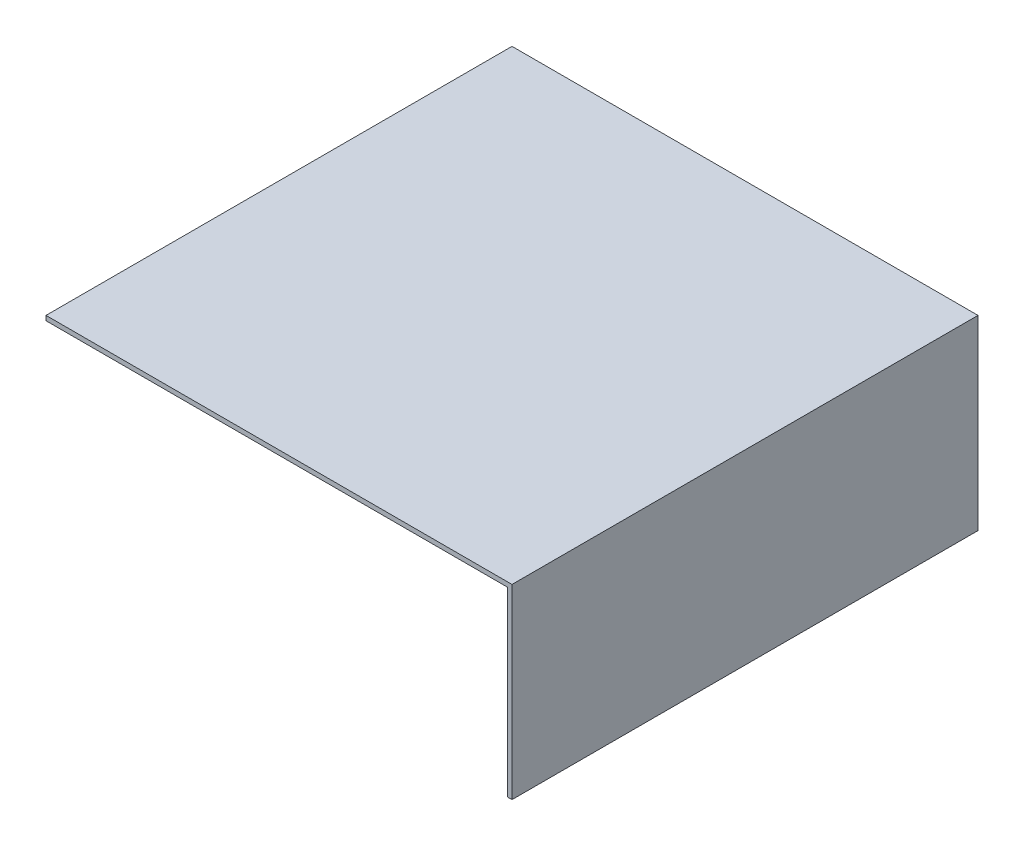
ISO-10303-21;
HEADER;
FILE_DESCRIPTION(('STEP AP214'),'2;1');
FILE_NAME('part.step','',(''),(''),'','','');
FILE_SCHEMA(('AUTOMOTIVE_DESIGN { 1 0 10303 214 1 1 1 1 }'));
ENDSEC;
DATA;
#1=APPLICATION_CONTEXT('core data for automotive mechanical design processes');
#2=APPLICATION_PROTOCOL_DEFINITION('international standard','automotive_design',2000,#1);
#3=PRODUCT_CONTEXT('',#1,'mechanical');
#4=PRODUCT('Part','Part','',(#3));
#5=PRODUCT_RELATED_PRODUCT_CATEGORY('part','',(#4));
#6=PRODUCT_DEFINITION_FORMATION('','',#4);
#7=PRODUCT_DEFINITION_CONTEXT('part definition',#1,'design');
#8=PRODUCT_DEFINITION('design','',#6,#7);
#9=PRODUCT_DEFINITION_SHAPE('','',#8);
#10=(LENGTH_UNIT() NAMED_UNIT(*) SI_UNIT(.MILLI.,.METRE.));
#11=(NAMED_UNIT(*) PLANE_ANGLE_UNIT() SI_UNIT($,.RADIAN.));
#12=(NAMED_UNIT(*) SI_UNIT($,.STERADIAN.) SOLID_ANGLE_UNIT());
#13=UNCERTAINTY_MEASURE_WITH_UNIT(LENGTH_MEASURE(1.E-05),#10,'distance_accuracy_value','');
#14=(GEOMETRIC_REPRESENTATION_CONTEXT(3) GLOBAL_UNCERTAINTY_ASSIGNED_CONTEXT((#13)) GLOBAL_UNIT_ASSIGNED_CONTEXT((#10,
#11,#12)) REPRESENTATION_CONTEXT('',''));
#15=CARTESIAN_POINT('',(0.,0.,0.));
#16=DIRECTION('',(0.,0.,1.));
#17=DIRECTION('',(1.,0.,0.));
#18=AXIS2_PLACEMENT_3D('',#15,#16,#17);
#19=CARTESIAN_POINT('',(-500.,-5.,250.));
#20=DIRECTION('',(1.,0.,0.));
#21=DIRECTION('',(0.,0.,-1.));
#22=AXIS2_PLACEMENT_3D('',#19,#20,#21);
#23=PLANE('',#22);
#24=DIRECTION('',(0.,-1.,0.));
#25=VECTOR('',#24,1.);
#26=CARTESIAN_POINT('',(-500.,-5.,-250.));
#27=LINE('',#26,#25);
#28=CARTESIAN_POINT('',(-500.,0.,-250.));
#29=VERTEX_POINT('',#28);
#30=CARTESIAN_POINT('',(-500.,-5.,-250.));
#31=VERTEX_POINT('',#30);
#32=EDGE_CURVE('E117',#29,#31,#27,.T.);
#33=ORIENTED_EDGE('',*,*,#32,.T.);
#34=DIRECTION('',(0.,0.,-1.));
#35=VECTOR('',#34,1.);
#36=CARTESIAN_POINT('',(-500.,-5.,250.));
#37=LINE('',#36,#35);
#38=CARTESIAN_POINT('',(-500.,-5.,250.));
#39=VERTEX_POINT('',#38);
#40=EDGE_CURVE('E11',#39,#31,#37,.T.);
#41=ORIENTED_EDGE('',*,*,#40,.F.);
#42=DIRECTION('',(0.,-1.,0.));
#43=VECTOR('',#42,1.);
#44=CARTESIAN_POINT('',(-500.,-5.,250.));
#45=LINE('',#44,#43);
#46=CARTESIAN_POINT('',(-500.,0.,250.));
#47=VERTEX_POINT('',#46);
#48=EDGE_CURVE('E127',#47,#39,#45,.T.);
#49=ORIENTED_EDGE('',*,*,#48,.F.);
#50=DIRECTION('',(0.,0.,-1.));
#51=VECTOR('',#50,1.);
#52=CARTESIAN_POINT('',(-500.,0.,250.));
#53=LINE('',#52,#51);
#54=EDGE_CURVE('E113',#47,#29,#53,.T.);
#55=ORIENTED_EDGE('',*,*,#54,.T.);
#56=EDGE_LOOP('',(#33,#41,#49,#55));
#57=FACE_BOUND('',#56,.T.);
#58=ADVANCED_FACE('F33',(#57),#23,.F.);
#59=CARTESIAN_POINT('',(-4.99999999999998,-5.,250.));
#60=DIRECTION('',(0.,1.,0.));
#61=DIRECTION('',(-1.,0.,0.));
#62=AXIS2_PLACEMENT_3D('',#59,#60,#61);
#63=PLANE('',#62);
#64=DIRECTION('',(1.,0.,0.));
#65=VECTOR('',#64,1.);
#66=CARTESIAN_POINT('',(-4.99999999999998,-5.,-250.));
#67=LINE('',#66,#65);
#68=CARTESIAN_POINT('',(-4.99999999999998,-5.,-250.));
#69=VERTEX_POINT('',#68);
#70=EDGE_CURVE('E120',#31,#69,#67,.T.);
#71=ORIENTED_EDGE('',*,*,#70,.T.);
#72=DIRECTION('',(0.,0.,-1.));
#73=VECTOR('',#72,1.);
#74=CARTESIAN_POINT('',(-4.99999999999998,-5.,250.));
#75=LINE('',#74,#73);
#76=CARTESIAN_POINT('',(-4.99999999999998,-5.,250.));
#77=VERTEX_POINT('',#76);
#78=EDGE_CURVE('E41',#77,#69,#75,.T.);
#79=ORIENTED_EDGE('',*,*,#78,.F.);
#80=DIRECTION('',(1.,0.,0.));
#81=VECTOR('',#80,1.);
#82=CARTESIAN_POINT('',(-4.99999999999998,-5.,250.));
#83=LINE('',#82,#81);
#84=EDGE_CURVE('E86',#39,#77,#83,.T.);
#85=ORIENTED_EDGE('',*,*,#84,.F.);
#86=ORIENTED_EDGE('',*,*,#40,.T.);
#87=EDGE_LOOP('',(#71,#79,#85,#86));
#88=FACE_BOUND('',#87,.T.);
#89=ADVANCED_FACE('F151',(#88),#63,.F.);
#90=CARTESIAN_POINT('',(-4.99999999999998,-200.,250.));
#91=DIRECTION('',(1.,0.,0.));
#92=DIRECTION('',(0.,0.,-1.));
#93=AXIS2_PLACEMENT_3D('',#90,#91,#92);
#94=PLANE('',#93);
#95=DIRECTION('',(0.,-1.,0.));
#96=VECTOR('',#95,1.);
#97=CARTESIAN_POINT('',(-4.99999999999998,-200.,-250.));
#98=LINE('',#97,#96);
#99=CARTESIAN_POINT('',(-4.99999999999998,-200.,-250.));
#100=VERTEX_POINT('',#99);
#101=EDGE_CURVE('E122',#69,#100,#98,.T.);
#102=ORIENTED_EDGE('',*,*,#101,.T.);
#103=DIRECTION('',(0.,0.,-1.));
#104=VECTOR('',#103,1.);
#105=CARTESIAN_POINT('',(-4.99999999999998,-200.,250.));
#106=LINE('',#105,#104);
#107=CARTESIAN_POINT('',(-4.99999999999998,-200.,250.));
#108=VERTEX_POINT('',#107);
#109=EDGE_CURVE('E108',#108,#100,#106,.T.);
#110=ORIENTED_EDGE('',*,*,#109,.F.);
#111=DIRECTION('',(0.,-1.,0.));
#112=VECTOR('',#111,1.);
#113=CARTESIAN_POINT('',(-4.99999999999998,-200.,250.));
#114=LINE('',#113,#112);
#115=EDGE_CURVE('E99',#77,#108,#114,.T.);
#116=ORIENTED_EDGE('',*,*,#115,.F.);
#117=ORIENTED_EDGE('',*,*,#78,.T.);
#118=EDGE_LOOP('',(#102,#110,#116,#117));
#119=FACE_BOUND('',#118,.T.);
#120=ADVANCED_FACE('F133',(#119),#94,.F.);
#121=CARTESIAN_POINT('',(0.,-200.,250.));
#122=DIRECTION('',(0.,1.,0.));
#123=DIRECTION('',(0.,0.,1.));
#124=AXIS2_PLACEMENT_3D('',#121,#122,#123);
#125=PLANE('',#124);
#126=DIRECTION('',(1.,0.,0.));
#127=VECTOR('',#126,1.);
#128=CARTESIAN_POINT('',(0.,-200.,-250.));
#129=LINE('',#128,#127);
#130=CARTESIAN_POINT('',(0.,-200.,-250.));
#131=VERTEX_POINT('',#130);
#132=EDGE_CURVE('E107',#100,#131,#129,.T.);
#133=ORIENTED_EDGE('',*,*,#132,.T.);
#134=DIRECTION('',(0.,0.,-1.));
#135=VECTOR('',#134,1.);
#136=CARTESIAN_POINT('',(0.,-200.,250.));
#137=LINE('',#136,#135);
#138=CARTESIAN_POINT('',(0.,-200.,250.));
#139=VERTEX_POINT('',#138);
#140=EDGE_CURVE('E104',#139,#131,#137,.T.);
#141=ORIENTED_EDGE('',*,*,#140,.F.);
#142=DIRECTION('',(1.,0.,0.));
#143=VECTOR('',#142,1.);
#144=CARTESIAN_POINT('',(0.,-200.,250.));
#145=LINE('',#144,#143);
#146=EDGE_CURVE('E93',#108,#139,#145,.T.);
#147=ORIENTED_EDGE('',*,*,#146,.F.);
#148=ORIENTED_EDGE('',*,*,#109,.T.);
#149=EDGE_LOOP('',(#133,#141,#147,#148));
#150=FACE_BOUND('',#149,.T.);
#151=ADVANCED_FACE('F105',(#150),#125,.F.);
#152=CARTESIAN_POINT('',(0.,0.,250.));
#153=DIRECTION('',(-1.,0.,0.));
#154=DIRECTION('',(0.,-1.,0.));
#155=AXIS2_PLACEMENT_3D('',#152,#153,#154);
#156=PLANE('',#155);
#157=DIRECTION('',(0.,1.,0.));
#158=VECTOR('',#157,1.);
#159=CARTESIAN_POINT('',(0.,0.,-250.));
#160=LINE('',#159,#158);
#161=CARTESIAN_POINT('',(0.,0.,-250.));
#162=VERTEX_POINT('',#161);
#163=EDGE_CURVE('E72',#131,#162,#160,.T.);
#164=ORIENTED_EDGE('',*,*,#163,.T.);
#165=DIRECTION('',(0.,0.,-1.));
#166=VECTOR('',#165,1.);
#167=CARTESIAN_POINT('',(0.,0.,250.));
#168=LINE('',#167,#166);
#169=CARTESIAN_POINT('',(0.,0.,250.));
#170=VERTEX_POINT('',#169);
#171=EDGE_CURVE('E109',#170,#162,#168,.T.);
#172=ORIENTED_EDGE('',*,*,#171,.F.);
#173=DIRECTION('',(0.,1.,0.));
#174=VECTOR('',#173,1.);
#175=CARTESIAN_POINT('',(0.,0.,250.));
#176=LINE('',#175,#174);
#177=EDGE_CURVE('E97',#139,#170,#176,.T.);
#178=ORIENTED_EDGE('',*,*,#177,.F.);
#179=ORIENTED_EDGE('',*,*,#140,.T.);
#180=EDGE_LOOP('',(#164,#172,#178,#179));
#181=FACE_BOUND('',#180,.T.);
#182=ADVANCED_FACE('F111',(#181),#156,.F.);
#183=CARTESIAN_POINT('',(-500.,0.,250.));
#184=DIRECTION('',(0.,-1.,0.));
#185=DIRECTION('',(0.,0.,-1.));
#186=AXIS2_PLACEMENT_3D('',#183,#184,#185);
#187=PLANE('',#186);
#188=DIRECTION('',(-1.,0.,0.));
#189=VECTOR('',#188,1.);
#190=CARTESIAN_POINT('',(-500.,0.,-250.));
#191=LINE('',#190,#189);
#192=EDGE_CURVE('E78',#162,#29,#191,.T.);
#193=ORIENTED_EDGE('',*,*,#192,.T.);
#194=ORIENTED_EDGE('',*,*,#54,.F.);
#195=DIRECTION('',(-1.,0.,0.));
#196=VECTOR('',#195,1.);
#197=CARTESIAN_POINT('',(-500.,0.,250.));
#198=LINE('',#197,#196);
#199=EDGE_CURVE('E49',#170,#47,#198,.T.);
#200=ORIENTED_EDGE('',*,*,#199,.F.);
#201=ORIENTED_EDGE('',*,*,#171,.T.);
#202=EDGE_LOOP('',(#193,#194,#200,#201));
#203=FACE_BOUND('',#202,.T.);
#204=ADVANCED_FACE('F140',(#203),#187,.F.);
#205=CARTESIAN_POINT('',(0.,0.,250.));
#206=DIRECTION('',(0.,0.,-1.));
#207=DIRECTION('',(-1.,0.,0.));
#208=AXIS2_PLACEMENT_3D('',#205,#206,#207);
#209=PLANE('',#208);
#210=ORIENTED_EDGE('',*,*,#48,.T.);
#211=ORIENTED_EDGE('',*,*,#84,.T.);
#212=ORIENTED_EDGE('',*,*,#115,.T.);
#213=ORIENTED_EDGE('',*,*,#146,.T.);
#214=ORIENTED_EDGE('',*,*,#177,.T.);
#215=ORIENTED_EDGE('',*,*,#199,.T.);
#216=EDGE_LOOP('',(#210,#211,#212,#213,#214,#215));
#217=FACE_BOUND('',#216,.T.);
#218=ADVANCED_FACE('F95',(#217),#209,.F.);
#219=CARTESIAN_POINT('',(0.,0.,-250.));
#220=DIRECTION('',(0.,0.,-1.));
#221=DIRECTION('',(-1.,0.,0.));
#222=AXIS2_PLACEMENT_3D('',#219,#220,#221);
#223=PLANE('',#222);
#224=ORIENTED_EDGE('',*,*,#32,.F.);
#225=ORIENTED_EDGE('',*,*,#192,.F.);
#226=ORIENTED_EDGE('',*,*,#163,.F.);
#227=ORIENTED_EDGE('',*,*,#132,.F.);
#228=ORIENTED_EDGE('',*,*,#101,.F.);
#229=ORIENTED_EDGE('',*,*,#70,.F.);
#230=EDGE_LOOP('',(#224,#225,#226,#227,#228,#229));
#231=FACE_BOUND('',#230,.T.);
#232=ADVANCED_FACE('F136',(#231),#223,.T.);
#233=CLOSED_SHELL('',(#58,#89,#120,#151,#182,#204,#218,#232));
#234=MANIFOLD_SOLID_BREP('B2',#233);
#235=ADVANCED_BREP_SHAPE_REPRESENTATION('',(#18,#234),#14);
#236=SHAPE_DEFINITION_REPRESENTATION(#9,#235);
ENDSEC;
END-ISO-10303-21;
